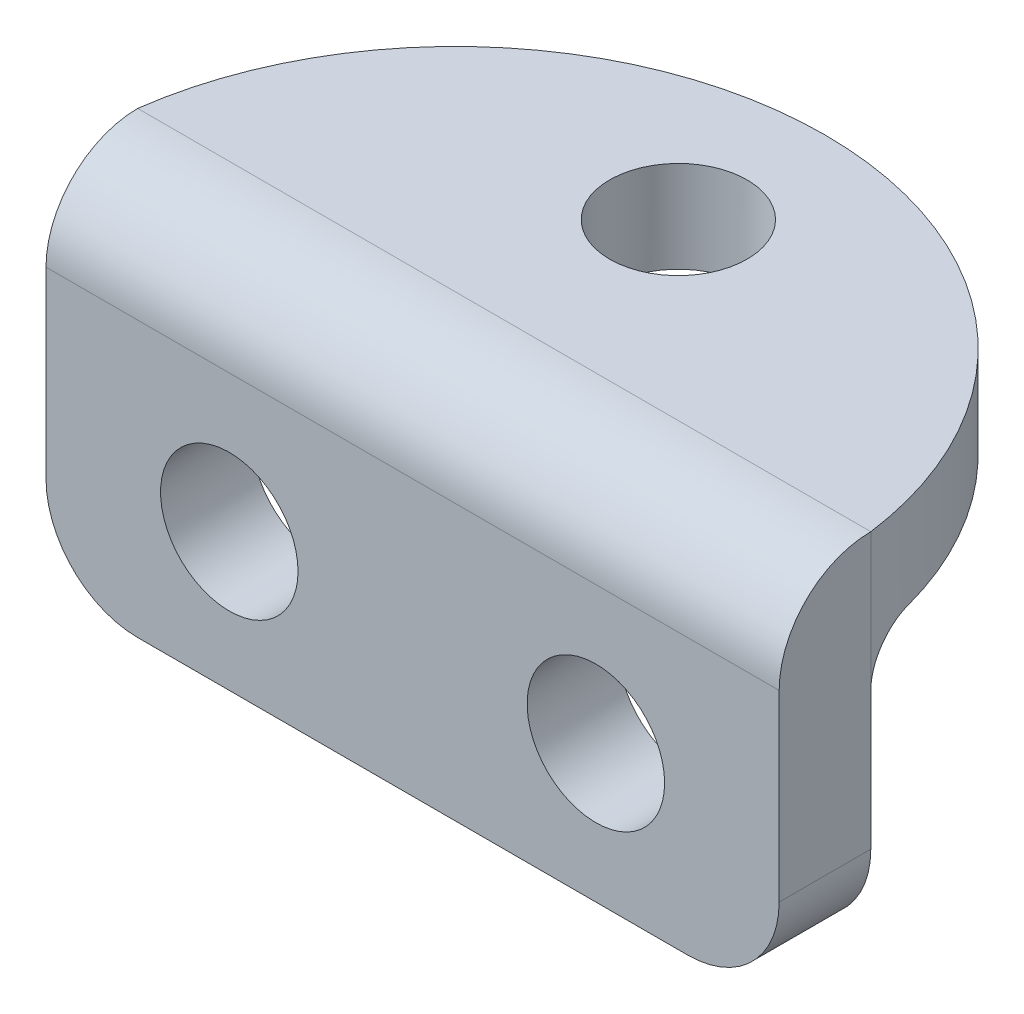
ISO-10303-21;
HEADER;
FILE_DESCRIPTION(('STEP AP214'),'2;1');
FILE_NAME('part.step','',(''),(''),'','','');
FILE_SCHEMA(('AUTOMOTIVE_DESIGN { 1 0 10303 214 1 1 1 1 }'));
ENDSEC;
DATA;
#1=APPLICATION_CONTEXT('core data for automotive mechanical design processes');
#2=APPLICATION_PROTOCOL_DEFINITION('international standard','automotive_design',2000,#1);
#3=PRODUCT_CONTEXT('',#1,'mechanical');
#4=PRODUCT('Part','Part','',(#3));
#5=PRODUCT_RELATED_PRODUCT_CATEGORY('part','',(#4));
#6=PRODUCT_DEFINITION_FORMATION('','',#4);
#7=PRODUCT_DEFINITION_CONTEXT('part definition',#1,'design');
#8=PRODUCT_DEFINITION('design','',#6,#7);
#9=PRODUCT_DEFINITION_SHAPE('','',#8);
#10=(LENGTH_UNIT() NAMED_UNIT(*) SI_UNIT(.MILLI.,.METRE.));
#11=(NAMED_UNIT(*) PLANE_ANGLE_UNIT() SI_UNIT($,.RADIAN.));
#12=(NAMED_UNIT(*) SI_UNIT($,.STERADIAN.) SOLID_ANGLE_UNIT());
#13=UNCERTAINTY_MEASURE_WITH_UNIT(LENGTH_MEASURE(1.E-05),#10,'distance_accuracy_value','');
#14=(GEOMETRIC_REPRESENTATION_CONTEXT(3) GLOBAL_UNCERTAINTY_ASSIGNED_CONTEXT((#13)) GLOBAL_UNIT_ASSIGNED_CONTEXT((#10,
#11,#12)) REPRESENTATION_CONTEXT('',''));
#15=CARTESIAN_POINT('',(0.,0.,0.));
#16=DIRECTION('',(0.,0.,1.));
#17=DIRECTION('',(1.,0.,0.));
#18=AXIS2_PLACEMENT_3D('',#15,#16,#17);
#19=CARTESIAN_POINT('',(16.,-0.121921178847406,0.));
#20=DIRECTION('',(0.,-1.,0.));
#21=DIRECTION('',(0.,0.,-1.));
#22=AXIS2_PLACEMENT_3D('',#19,#20,#21);
#23=PLANE('',#22);
#24=CARTESIAN_POINT('',(8.,-0.121921178847404,-15.2803208701207));
#25=DIRECTION('',(0.,-1.,0.));
#26=DIRECTION('',(0.,0.,-1.));
#27=AXIS2_PLACEMENT_3D('',#24,#25,#26);
#28=CIRCLE('',#27,1.5);
#29=CARTESIAN_POINT('',(8.,-0.121921178847404,-16.7803208701207));
#30=VERTEX_POINT('',#29);
#31=EDGE_CURVE('E234',#30,#30,#28,.T.);
#32=ORIENTED_EDGE('',*,*,#31,.F.);
#33=EDGE_LOOP('',(#32));
#34=FACE_BOUND('',#33,.T.);
#35=CARTESIAN_POINT('',(8.,-0.121921178847405,-10.4088922986921));
#36=DIRECTION('',(0.,-1.,0.));
#37=DIRECTION('',(0.,0.,-1.));
#38=AXIS2_PLACEMENT_3D('',#35,#36,#37);
#39=CIRCLE('',#38,8.07142857142857);
#40=CARTESIAN_POINT('',(0.198901176299402,-0.121921178847405,-12.4803208701207));
#41=VERTEX_POINT('',#40);
#42=CARTESIAN_POINT('',(15.8010988237006,-0.121921178847405,-12.4803208701207));
#43=VERTEX_POINT('',#42);
#44=EDGE_CURVE('E137',#41,#43,#39,.T.);
#45=ORIENTED_EDGE('',*,*,#44,.T.);
#46=DIRECTION('',(-1.,0.,0.));
#47=VECTOR('',#46,1.);
#48=CARTESIAN_POINT('',(0.,-0.121921178847405,-12.4803208701207));
#49=LINE('',#48,#47);
#50=EDGE_CURVE('E153',#43,#41,#49,.T.);
#51=ORIENTED_EDGE('',*,*,#50,.T.);
#52=EDGE_LOOP('',(#45,#51));
#53=FACE_BOUND('',#52,.T.);
#54=ADVANCED_FACE('F55',(#34,#53),#23,.T.);
#55=CARTESIAN_POINT('',(16.,1.8780788211526,0.));
#56=DIRECTION('',(0.,1.,0.));
#57=DIRECTION('',(0.,0.,1.));
#58=AXIS2_PLACEMENT_3D('',#55,#56,#57);
#59=PLANE('',#58);
#60=CARTESIAN_POINT('',(8.,1.8780788211526,-15.2803208701207));
#61=DIRECTION('',(0.,1.,0.));
#62=DIRECTION('',(0.,0.,1.));
#63=AXIS2_PLACEMENT_3D('',#60,#61,#62);
#64=CIRCLE('',#63,1.5);
#65=CARTESIAN_POINT('',(8.,1.8780788211526,-13.7803208701207));
#66=VERTEX_POINT('',#65);
#67=EDGE_CURVE('E289',#66,#66,#64,.T.);
#68=ORIENTED_EDGE('',*,*,#67,.F.);
#69=EDGE_LOOP('',(#68));
#70=FACE_BOUND('',#69,.T.);
#71=CARTESIAN_POINT('',(8.,1.8780788211526,-10.4088922986921));
#72=DIRECTION('',(0.,1.,0.));
#73=DIRECTION('',(0.,0.,1.));
#74=AXIS2_PLACEMENT_3D('',#71,#72,#73);
#75=CIRCLE('',#74,8.07142857142857);
#76=CARTESIAN_POINT('',(16.,1.8780788211526,-11.4803208701207));
#77=VERTEX_POINT('',#76);
#78=CARTESIAN_POINT('',(0.,1.8780788211526,-11.4803208701207));
#79=VERTEX_POINT('',#78);
#80=EDGE_CURVE('E124',#77,#79,#75,.T.);
#81=ORIENTED_EDGE('',*,*,#80,.T.);
#82=DIRECTION('',(-1.,0.,0.));
#83=VECTOR('',#82,1.);
#84=CARTESIAN_POINT('',(16.,1.8780788211526,-11.4803208701207));
#85=LINE('',#84,#83);
#86=EDGE_CURVE('E121',#79,#77,#85,.F.);
#87=ORIENTED_EDGE('',*,*,#86,.T.);
#88=EDGE_LOOP('',(#81,#87));
#89=FACE_BOUND('',#88,.T.);
#90=ADVANCED_FACE('F123',(#70,#89),#59,.T.);
#91=CARTESIAN_POINT('',(16.,0.,0.));
#92=DIRECTION('',(1.,0.,0.));
#93=DIRECTION('',(0.,0.,-1.));
#94=AXIS2_PLACEMENT_3D('',#91,#92,#93);
#95=PLANE('',#94);
#96=DIRECTION('',(0.,-1.,0.));
#97=VECTOR('',#96,1.);
#98=CARTESIAN_POINT('',(16.,15.8780788211526,-11.4803208701207));
#99=LINE('',#98,#97);
#100=CARTESIAN_POINT('',(16.,-1.1219211788474,-11.4803208701207));
#101=VERTEX_POINT('',#100);
#102=EDGE_CURVE('E133',#101,#77,#99,.F.);
#103=ORIENTED_EDGE('',*,*,#102,.T.);
#104=CARTESIAN_POINT('',(16.,-0.121921178847404,-11.4803208701207));
#105=DIRECTION('',(1.,0.,0.));
#106=DIRECTION('',(0.,0.,-1.));
#107=AXIS2_PLACEMENT_3D('',#104,#105,#106);
#108=CIRCLE('',#107,2.);
#109=CARTESIAN_POINT('',(16.,-0.121921178847404,-9.48032087012068));
#110=VERTEX_POINT('',#109);
#111=EDGE_CURVE('E127',#77,#110,#108,.T.);
#112=ORIENTED_EDGE('',*,*,#111,.T.);
#113=DIRECTION('',(0.,1.,0.));
#114=VECTOR('',#113,1.);
#115=CARTESIAN_POINT('',(16.,0.,-9.48032087012068));
#116=LINE('',#115,#114);
#117=CARTESIAN_POINT('',(16.,-4.1219211788474,-9.48032087012068));
#118=VERTEX_POINT('',#117);
#119=EDGE_CURVE('E243',#118,#110,#116,.T.);
#120=ORIENTED_EDGE('',*,*,#119,.F.);
#121=DIRECTION('',(0.,0.,1.));
#122=VECTOR('',#121,1.);
#123=CARTESIAN_POINT('',(16.,-4.1219211788474,0.));
#124=LINE('',#123,#122);
#125=CARTESIAN_POINT('',(16.,-4.1219211788474,-11.4803208701207));
#126=VERTEX_POINT('',#125);
#127=EDGE_CURVE('E264',#118,#126,#124,.F.);
#128=ORIENTED_EDGE('',*,*,#127,.T.);
#129=DIRECTION('',(0.,-1.,0.));
#130=VECTOR('',#129,1.);
#131=CARTESIAN_POINT('',(16.,0.,-11.4803208701207));
#132=LINE('',#131,#130);
#133=EDGE_CURVE('E145',#101,#126,#132,.T.);
#134=ORIENTED_EDGE('',*,*,#133,.F.);
#135=EDGE_LOOP('',(#103,#112,#120,#128,#134));
#136=FACE_BOUND('',#135,.T.);
#137=ADVANCED_FACE('F141',(#136),#95,.T.);
#138=CARTESIAN_POINT('',(0.,0.,0.));
#139=DIRECTION('',(1.,0.,0.));
#140=DIRECTION('',(0.,0.,-1.));
#141=AXIS2_PLACEMENT_3D('',#138,#139,#140);
#142=PLANE('',#141);
#143=DIRECTION('',(0.,1.,0.));
#144=VECTOR('',#143,1.);
#145=CARTESIAN_POINT('',(0.,0.,-9.48032087012068));
#146=LINE('',#145,#144);
#147=CARTESIAN_POINT('',(0.,-4.1219211788474,-9.48032087012068));
#148=VERTEX_POINT('',#147);
#149=CARTESIAN_POINT('',(0.,-0.121921178847404,-9.48032087012068));
#150=VERTEX_POINT('',#149);
#151=EDGE_CURVE('E244',#148,#150,#146,.T.);
#152=ORIENTED_EDGE('',*,*,#151,.T.);
#153=CARTESIAN_POINT('',(0.,-0.121921178847404,-11.4803208701207));
#154=DIRECTION('',(1.,0.,0.));
#155=DIRECTION('',(0.,0.,-1.));
#156=AXIS2_PLACEMENT_3D('',#153,#154,#155);
#157=CIRCLE('',#156,2.);
#158=EDGE_CURVE('E128',#150,#79,#157,.F.);
#159=ORIENTED_EDGE('',*,*,#158,.T.);
#160=DIRECTION('',(0.,-1.,0.));
#161=VECTOR('',#160,1.);
#162=CARTESIAN_POINT('',(0.,15.8780788211526,-11.4803208701207));
#163=LINE('',#162,#161);
#164=CARTESIAN_POINT('',(0.,-1.1219211788474,-11.4803208701207));
#165=VERTEX_POINT('',#164);
#166=EDGE_CURVE('E76',#165,#79,#163,.F.);
#167=ORIENTED_EDGE('',*,*,#166,.F.);
#168=DIRECTION('',(0.,-1.,0.));
#169=VECTOR('',#168,1.);
#170=CARTESIAN_POINT('',(0.,0.,-11.4803208701207));
#171=LINE('',#170,#169);
#172=CARTESIAN_POINT('',(0.,-4.1219211788474,-11.4803208701207));
#173=VERTEX_POINT('',#172);
#174=EDGE_CURVE('E136',#165,#173,#171,.T.);
#175=ORIENTED_EDGE('',*,*,#174,.T.);
#176=DIRECTION('',(0.,0.,1.));
#177=VECTOR('',#176,1.);
#178=CARTESIAN_POINT('',(0.,-4.1219211788474,-9.48032087012068));
#179=LINE('',#178,#177);
#180=EDGE_CURVE('E271',#173,#148,#179,.T.);
#181=ORIENTED_EDGE('',*,*,#180,.T.);
#182=EDGE_LOOP('',(#152,#159,#167,#175,#181));
#183=FACE_BOUND('',#182,.T.);
#184=ADVANCED_FACE('F174',(#183),#142,.F.);
#185=CARTESIAN_POINT('',(16.,-6.1219211788474,0.));
#186=DIRECTION('',(0.,-1.,0.));
#187=DIRECTION('',(0.,0.,-1.));
#188=AXIS2_PLACEMENT_3D('',#185,#186,#187);
#189=PLANE('',#188);
#190=DIRECTION('',(-1.,0.,0.));
#191=VECTOR('',#190,1.);
#192=CARTESIAN_POINT('',(16.,-6.1219211788474,-11.4803208701207));
#193=LINE('',#192,#191);
#194=CARTESIAN_POINT('',(14.,-6.1219211788474,-11.4803208701207));
#195=VERTEX_POINT('',#194);
#196=CARTESIAN_POINT('',(2.,-6.1219211788474,-11.4803208701207));
#197=VERTEX_POINT('',#196);
#198=EDGE_CURVE('E252',#195,#197,#193,.T.);
#199=ORIENTED_EDGE('',*,*,#198,.F.);
#200=DIRECTION('',(0.,0.,1.));
#201=VECTOR('',#200,1.);
#202=CARTESIAN_POINT('',(14.,-6.1219211788474,0.));
#203=LINE('',#202,#201);
#204=CARTESIAN_POINT('',(14.,-6.1219211788474,-9.48032087012068));
#205=VERTEX_POINT('',#204);
#206=EDGE_CURVE('E257',#195,#205,#203,.T.);
#207=ORIENTED_EDGE('',*,*,#206,.T.);
#208=DIRECTION('',(-1.,0.,0.));
#209=VECTOR('',#208,1.);
#210=CARTESIAN_POINT('',(16.,-6.1219211788474,-9.48032087012068));
#211=LINE('',#210,#209);
#212=CARTESIAN_POINT('',(2.,-6.1219211788474,-9.48032087012068));
#213=VERTEX_POINT('',#212);
#214=EDGE_CURVE('E246',#205,#213,#211,.T.);
#215=ORIENTED_EDGE('',*,*,#214,.T.);
#216=DIRECTION('',(0.,0.,1.));
#217=VECTOR('',#216,1.);
#218=CARTESIAN_POINT('',(2.,-6.1219211788474,-11.4803208701207));
#219=LINE('',#218,#217);
#220=EDGE_CURVE('E147',#213,#197,#219,.F.);
#221=ORIENTED_EDGE('',*,*,#220,.T.);
#222=EDGE_LOOP('',(#199,#207,#215,#221));
#223=FACE_BOUND('',#222,.T.);
#224=ADVANCED_FACE('F177',(#223),#189,.T.);
#225=CARTESIAN_POINT('',(16.,0.,-11.4803208701207));
#226=DIRECTION('',(0.,0.,-1.));
#227=DIRECTION('',(-1.,0.,0.));
#228=AXIS2_PLACEMENT_3D('',#225,#226,#227);
#229=PLANE('',#228);
#230=CARTESIAN_POINT('',(4.,-3.1219211788474,-11.4803208701207));
#231=DIRECTION('',(0.,0.,-1.));
#232=DIRECTION('',(-1.,0.,0.));
#233=AXIS2_PLACEMENT_3D('',#230,#231,#232);
#234=CIRCLE('',#233,1.5);
#235=CARTESIAN_POINT('',(2.5,-3.1219211788474,-11.4803208701207));
#236=VERTEX_POINT('',#235);
#237=EDGE_CURVE('E224',#236,#236,#234,.T.);
#238=ORIENTED_EDGE('',*,*,#237,.F.);
#239=EDGE_LOOP('',(#238));
#240=FACE_BOUND('',#239,.T.);
#241=CARTESIAN_POINT('',(12.,-3.1219211788474,-11.4803208701207));
#242=DIRECTION('',(0.,0.,-1.));
#243=DIRECTION('',(-1.,0.,0.));
#244=AXIS2_PLACEMENT_3D('',#241,#242,#243);
#245=CIRCLE('',#244,1.5);
#246=CARTESIAN_POINT('',(10.5,-3.1219211788474,-11.4803208701207));
#247=VERTEX_POINT('',#246);
#248=EDGE_CURVE('E228',#247,#247,#245,.T.);
#249=ORIENTED_EDGE('',*,*,#248,.F.);
#250=EDGE_LOOP('',(#249));
#251=FACE_BOUND('',#250,.T.);
#252=ORIENTED_EDGE('',*,*,#174,.F.);
#253=DIRECTION('',(-1.,0.,0.));
#254=VECTOR('',#253,1.);
#255=CARTESIAN_POINT('',(16.,-1.1219211788474,-11.4803208701207));
#256=LINE('',#255,#254);
#257=EDGE_CURVE('E156',#165,#101,#256,.F.);
#258=ORIENTED_EDGE('',*,*,#257,.T.);
#259=ORIENTED_EDGE('',*,*,#133,.T.);
#260=CARTESIAN_POINT('',(14.,-4.1219211788474,-11.4803208701207));
#261=DIRECTION('',(0.,0.,-1.));
#262=DIRECTION('',(-1.,0.,0.));
#263=AXIS2_PLACEMENT_3D('',#260,#261,#262);
#264=CIRCLE('',#263,2.);
#265=EDGE_CURVE('E269',#126,#195,#264,.T.);
#266=ORIENTED_EDGE('',*,*,#265,.T.);
#267=ORIENTED_EDGE('',*,*,#198,.T.);
#268=CARTESIAN_POINT('',(2.,-4.1219211788474,-11.4803208701207));
#269=DIRECTION('',(0.,0.,-1.));
#270=DIRECTION('',(-1.,0.,0.));
#271=AXIS2_PLACEMENT_3D('',#268,#269,#270);
#272=CIRCLE('',#271,2.);
#273=EDGE_CURVE('E266',#197,#173,#272,.T.);
#274=ORIENTED_EDGE('',*,*,#273,.T.);
#275=EDGE_LOOP('',(#252,#258,#259,#266,#267,#274));
#276=FACE_BOUND('',#275,.T.);
#277=ADVANCED_FACE('F180',(#240,#251,#276),#229,.T.);
#278=CARTESIAN_POINT('',(16.,0.,-9.48032087012068));
#279=DIRECTION('',(0.,0.,1.));
#280=DIRECTION('',(1.,0.,0.));
#281=AXIS2_PLACEMENT_3D('',#278,#279,#280);
#282=PLANE('',#281);
#283=CARTESIAN_POINT('',(4.,-3.1219211788474,-9.48032087012068));
#284=DIRECTION('',(0.,0.,1.));
#285=DIRECTION('',(1.,0.,0.));
#286=AXIS2_PLACEMENT_3D('',#283,#284,#285);
#287=CIRCLE('',#286,1.5);
#288=CARTESIAN_POINT('',(5.5,-3.1219211788474,-9.48032087012068));
#289=VERTEX_POINT('',#288);
#290=EDGE_CURVE('E227',#289,#289,#287,.T.);
#291=ORIENTED_EDGE('',*,*,#290,.F.);
#292=EDGE_LOOP('',(#291));
#293=FACE_BOUND('',#292,.T.);
#294=CARTESIAN_POINT('',(12.,-3.1219211788474,-9.48032087012068));
#295=DIRECTION('',(0.,0.,1.));
#296=DIRECTION('',(1.,0.,0.));
#297=AXIS2_PLACEMENT_3D('',#294,#295,#296);
#298=CIRCLE('',#297,1.5);
#299=CARTESIAN_POINT('',(13.5,-3.1219211788474,-9.48032087012068));
#300=VERTEX_POINT('',#299);
#301=EDGE_CURVE('E229',#300,#300,#298,.T.);
#302=ORIENTED_EDGE('',*,*,#301,.F.);
#303=EDGE_LOOP('',(#302));
#304=FACE_BOUND('',#303,.T.);
#305=ORIENTED_EDGE('',*,*,#119,.T.);
#306=DIRECTION('',(-1.,0.,0.));
#307=VECTOR('',#306,1.);
#308=CARTESIAN_POINT('',(16.,-0.121921178847404,-9.48032087012068));
#309=LINE('',#308,#307);
#310=EDGE_CURVE('E152',#110,#150,#309,.T.);
#311=ORIENTED_EDGE('',*,*,#310,.T.);
#312=ORIENTED_EDGE('',*,*,#151,.F.);
#313=CARTESIAN_POINT('',(2.,-4.1219211788474,-9.48032087012068));
#314=DIRECTION('',(0.,0.,1.));
#315=DIRECTION('',(1.,0.,0.));
#316=AXIS2_PLACEMENT_3D('',#313,#314,#315);
#317=CIRCLE('',#316,2.);
#318=EDGE_CURVE('E260',#148,#213,#317,.T.);
#319=ORIENTED_EDGE('',*,*,#318,.T.);
#320=ORIENTED_EDGE('',*,*,#214,.F.);
#321=CARTESIAN_POINT('',(14.,-4.1219211788474,-9.48032087012068));
#322=DIRECTION('',(0.,0.,1.));
#323=DIRECTION('',(1.,0.,0.));
#324=AXIS2_PLACEMENT_3D('',#321,#322,#323);
#325=CIRCLE('',#324,2.);
#326=EDGE_CURVE('E262',#205,#118,#325,.T.);
#327=ORIENTED_EDGE('',*,*,#326,.T.);
#328=EDGE_LOOP('',(#305,#311,#312,#319,#320,#327));
#329=FACE_BOUND('',#328,.T.);
#330=ADVANCED_FACE('F169',(#293,#304,#329),#282,.T.);
#331=CARTESIAN_POINT('',(8.,15.8780788211526,-10.4088922986921));
#332=DIRECTION('',(0.,-1.,0.));
#333=DIRECTION('',(0.,0.,-1.));
#334=AXIS2_PLACEMENT_3D('',#331,#332,#333);
#335=CYLINDRICAL_SURFACE('',#334,8.07142857142857);
#336=ORIENTED_EDGE('',*,*,#80,.F.);
#337=ORIENTED_EDGE('',*,*,#102,.F.);
#338=CARTESIAN_POINT('',(16.,-1.1219211788474,-11.4803208701207));
#339=CARTESIAN_POINT('',(15.9999991490153,-1.09402191808837,-11.480320939003));
#340=CARTESIAN_POINT('',(15.9998436253148,-1.06613603026993,-11.4814891734344));
#341=CARTESIAN_POINT('',(15.9992178033703,-1.01056405105537,-11.4861489392706));
#342=CARTESIAN_POINT('',(15.99874752094,-0.98287794969247,-11.4896403539572));
#343=CARTESIAN_POINT('',(15.9968585578795,-0.900470122004977,-11.5035638670049));
#344=CARTESIAN_POINT('',(15.9949617943377,-0.846300843133031,-11.5174453385814));
#345=CARTESIAN_POINT('',(15.9898076101543,-0.741085489695992,-11.5539993520695));
#346=CARTESIAN_POINT('',(15.9865495446691,-0.690040908444255,-11.5766760598867));
#347=CARTESIAN_POINT('',(15.9785500354431,-0.592517539336692,-11.6301318098737));
#348=CARTESIAN_POINT('',(15.9738088308123,-0.546038017093743,-11.6609095458791));
#349=CARTESIAN_POINT('',(15.962708365101,-0.458895926342724,-11.7296666078117));
#350=CARTESIAN_POINT('',(15.9563473927707,-0.418239581316981,-11.7676535392205));
#351=CARTESIAN_POINT('',(15.9419080374722,-0.343899454400456,-11.8496508399651));
#352=CARTESIAN_POINT('',(15.9338294816332,-0.310216375026246,-11.8936618154477));
#353=CARTESIAN_POINT('',(15.9158549191786,-0.25047951315113,-11.9866937934779));
#354=CARTESIAN_POINT('',(15.905946568888,-0.224480868761914,-12.0357477544523));
#355=CARTESIAN_POINT('',(15.8843998414832,-0.181030073611357,-12.1371518908471));
#356=CARTESIAN_POINT('',(15.8727616209696,-0.163577149841992,-12.18950176765));
#357=CARTESIAN_POINT('',(15.8512325316384,-0.141002529876753,-12.2817819724549));
#358=CARTESIAN_POINT('',(15.8417006351851,-0.133835424819346,-12.3213108117615));
#359=CARTESIAN_POINT('',(15.8219168845489,-0.1242950606116,-12.4006923836628));
#360=CARTESIAN_POINT('',(15.8116663006339,-0.121913553546356,-12.4405444399323));
#361=CARTESIAN_POINT('',(15.8010988237006,-0.121921178847405,-12.4803208701207));
#362=B_SPLINE_CURVE_WITH_KNOTS('',3,(#338,#339,#340,#341,#342,#343,#344,#345,#346,#347,#348,
#349,#350,#351,#352,#353,#354,#355,#356,#357,#358,#359,#360,#361),.UNSPECIFIED.,.F.,.F.,(4,2,2,
2,2,2,2,2,2,2,2,4),(0.,0.0836463373321406,0.167288472533645,0.334282402526227,0.501355526777565,
0.668401729577939,0.835625150649973,1.00286541033454,1.17127805625105,1.3396754654902,
1.46326802622647,1.58664739349271),.UNSPECIFIED.);
#363=EDGE_CURVE('E12',#101,#43,#362,.T.);
#364=ORIENTED_EDGE('',*,*,#363,.T.);
#365=ORIENTED_EDGE('',*,*,#44,.F.);
#366=CARTESIAN_POINT('',(0.198901176299402,-0.121921178847405,-12.4803208701207));
#367=CARTESIAN_POINT('',(0.191435132289089,-0.12192175330238,-12.4522065769295));
#368=CARTESIAN_POINT('',(0.184126006928799,-0.123107631137002,-12.4240633327082));
#369=CARTESIAN_POINT('',(0.169856981634202,-0.127861674351911,-12.3678863860747));
#370=CARTESIAN_POINT('',(0.162897124836641,-0.13143013322039,-12.3398526975856));
#371=CARTESIAN_POINT('',(0.142605042485588,-0.145720990497519,-12.2562097027423));
#372=CARTESIAN_POINT('',(0.129851635008769,-0.160028845284431,-12.2010257396098));
#373=CARTESIAN_POINT('',(0.106136247111141,-0.197999315006701,-12.0935042769422));
#374=CARTESIAN_POINT('',(0.0951766639535304,-0.221674306169483,-12.0411706478741));
#375=CARTESIAN_POINT('',(0.0751678935150616,-0.27781978951484,-11.9410799915713));
#376=CARTESIAN_POINT('',(0.0661175025913553,-0.310284710458862,-11.8933200912813));
#377=CARTESIAN_POINT('',(0.0500884648258515,-0.382332279618696,-11.8049027741473));
#378=CARTESIAN_POINT('',(0.043068516255584,-0.421742094701913,-11.7641119085061));
#379=CARTESIAN_POINT('',(0.0307450267131263,-0.507056894387428,-11.6896585903018));
#380=CARTESIAN_POINT('',(0.0254418859580454,-0.552963389897163,-11.6559978005119));
#381=CARTESIAN_POINT('',(0.0164932289229911,-0.649163145151464,-11.597356948573));
#382=CARTESIAN_POINT('',(0.0128230358620543,-0.699376376441992,-11.572249104412));
#383=CARTESIAN_POINT('',(0.0068914878204657,-0.803351105804519,-11.5307735285032));
#384=CARTESIAN_POINT('',(0.00462913463972533,-0.857110059874321,-11.5143996053265));
#385=CARTESIAN_POINT('',(0.00200600720420888,-0.946353069042149,-11.4952192978957));
#386=CARTESIAN_POINT('',(0.0012515197746216,-0.981253758828827,-11.4896355031823));
#387=CARTESIAN_POINT('',(0.000249894529710158,-1.05140495512885,-11.4821871231519));
#388=CARTESIAN_POINT('',(2.0120499165627E-06,-1.08665487155499,-11.4803170790647));
#389=CARTESIAN_POINT('',(0.,-1.1219211788474,-11.4803208701207));
#390=B_SPLINE_CURVE_WITH_KNOTS('',3,(#366,#367,#368,#369,#370,#371,#372,#373,#374,#375,#376,
#377,#378,#379,#380,#381,#382,#383,#384,#385,#386,#387,#388,#389),.UNSPECIFIED.,.F.,.F.,(4,2,2,
2,2,2,2,2,2,2,2,4),(0.,0.0872162248145195,0.174443194974273,0.348796827488553,0.523381596265678,
0.697855967617498,0.86848108288495,1.03914594517545,1.20713603296919,1.37500687470577,
1.48087905539599,1.58659550108932),.UNSPECIFIED.);
#391=EDGE_CURVE('E70',#41,#165,#390,.T.);
#392=ORIENTED_EDGE('',*,*,#391,.T.);
#393=ORIENTED_EDGE('',*,*,#166,.T.);
#394=EDGE_LOOP('',(#336,#337,#364,#365,#392,#393));
#395=FACE_BOUND('',#394,.T.);
#396=ADVANCED_FACE('F132',(#395),#335,.T.);
#397=CARTESIAN_POINT('',(12.,-3.1219211788474,-25.4803208701207));
#398=DIRECTION('',(0.,0.,1.));
#399=DIRECTION('',(1.,0.,0.));
#400=AXIS2_PLACEMENT_3D('',#397,#398,#399);
#401=CYLINDRICAL_SURFACE('',#400,1.5);
#402=ORIENTED_EDGE('',*,*,#248,.T.);
#403=EDGE_LOOP('',(#402));
#404=FACE_BOUND('',#403,.T.);
#405=ORIENTED_EDGE('',*,*,#301,.T.);
#406=EDGE_LOOP('',(#405));
#407=FACE_BOUND('',#406,.T.);
#408=ADVANCED_FACE('F168',(#404,#407),#401,.F.);
#409=CARTESIAN_POINT('',(4.,-3.1219211788474,-25.4803208701207));
#410=DIRECTION('',(0.,0.,1.));
#411=DIRECTION('',(1.,0.,0.));
#412=AXIS2_PLACEMENT_3D('',#409,#410,#411);
#413=CYLINDRICAL_SURFACE('',#412,1.5);
#414=ORIENTED_EDGE('',*,*,#237,.T.);
#415=EDGE_LOOP('',(#414));
#416=FACE_BOUND('',#415,.T.);
#417=ORIENTED_EDGE('',*,*,#290,.T.);
#418=EDGE_LOOP('',(#417));
#419=FACE_BOUND('',#418,.T.);
#420=ADVANCED_FACE('F198',(#416,#419),#413,.F.);
#421=CARTESIAN_POINT('',(14.,-4.1219211788474,0.));
#422=DIRECTION('',(0.,0.,1.));
#423=DIRECTION('',(1.,0.,0.));
#424=AXIS2_PLACEMENT_3D('',#421,#422,#423);
#425=CYLINDRICAL_SURFACE('',#424,2.);
#426=ORIENTED_EDGE('',*,*,#265,.F.);
#427=ORIENTED_EDGE('',*,*,#127,.F.);
#428=ORIENTED_EDGE('',*,*,#326,.F.);
#429=ORIENTED_EDGE('',*,*,#206,.F.);
#430=EDGE_LOOP('',(#426,#427,#428,#429));
#431=FACE_BOUND('',#430,.T.);
#432=ADVANCED_FACE('F194',(#431),#425,.T.);
#433=CARTESIAN_POINT('',(2.,-4.1219211788474,0.));
#434=DIRECTION('',(0.,0.,-1.));
#435=DIRECTION('',(-1.,0.,0.));
#436=AXIS2_PLACEMENT_3D('',#433,#434,#435);
#437=CYLINDRICAL_SURFACE('',#436,2.);
#438=ORIENTED_EDGE('',*,*,#273,.F.);
#439=ORIENTED_EDGE('',*,*,#220,.F.);
#440=ORIENTED_EDGE('',*,*,#318,.F.);
#441=ORIENTED_EDGE('',*,*,#180,.F.);
#442=EDGE_LOOP('',(#438,#439,#440,#441));
#443=FACE_BOUND('',#442,.T.);
#444=ADVANCED_FACE('F197',(#443),#437,.T.);
#445=CARTESIAN_POINT('',(16.,-0.121921178847404,-11.4803208701207));
#446=DIRECTION('',(-1.,0.,0.));
#447=DIRECTION('',(0.,0.,1.));
#448=AXIS2_PLACEMENT_3D('',#445,#446,#447);
#449=CYLINDRICAL_SURFACE('',#448,2.);
#450=ORIENTED_EDGE('',*,*,#111,.F.);
#451=ORIENTED_EDGE('',*,*,#86,.F.);
#452=ORIENTED_EDGE('',*,*,#158,.F.);
#453=ORIENTED_EDGE('',*,*,#310,.F.);
#454=EDGE_LOOP('',(#450,#451,#452,#453));
#455=FACE_BOUND('',#454,.T.);
#456=ADVANCED_FACE('F150',(#455),#449,.T.);
#457=CARTESIAN_POINT('',(8.,-14.1219211788474,-15.2803208701207));
#458=DIRECTION('',(0.,1.,0.));
#459=DIRECTION('',(0.,0.,1.));
#460=AXIS2_PLACEMENT_3D('',#457,#458,#459);
#461=CYLINDRICAL_SURFACE('',#460,1.5);
#462=ORIENTED_EDGE('',*,*,#31,.T.);
#463=EDGE_LOOP('',(#462));
#464=FACE_BOUND('',#463,.T.);
#465=ORIENTED_EDGE('',*,*,#67,.T.);
#466=EDGE_LOOP('',(#465));
#467=FACE_BOUND('',#466,.T.);
#468=ADVANCED_FACE('F203',(#464,#467),#461,.F.);
#469=CARTESIAN_POINT('',(16.,-1.1219211788474,-12.4803208701207));
#470=DIRECTION('',(1.,0.,0.));
#471=DIRECTION('',(0.,0.,-1.));
#472=AXIS2_PLACEMENT_3D('',#469,#470,#471);
#473=CYLINDRICAL_SURFACE('',#472,1.);
#474=ORIENTED_EDGE('',*,*,#363,.F.);
#475=ORIENTED_EDGE('',*,*,#257,.F.);
#476=ORIENTED_EDGE('',*,*,#391,.F.);
#477=ORIENTED_EDGE('',*,*,#50,.F.);
#478=EDGE_LOOP('',(#474,#475,#476,#477));
#479=FACE_BOUND('',#478,.T.);
#480=ADVANCED_FACE('F57',(#479),#473,.F.);
#481=CLOSED_SHELL('',(#54,#90,#137,#184,#224,#277,#330,#396,#408,#420,#432,#444,#456,#468,#480));
#482=MANIFOLD_SOLID_BREP('B2',#481);
#483=ADVANCED_BREP_SHAPE_REPRESENTATION('',(#18,#482),#14);
#484=SHAPE_DEFINITION_REPRESENTATION(#9,#483);
ENDSEC;
END-ISO-10303-21;
